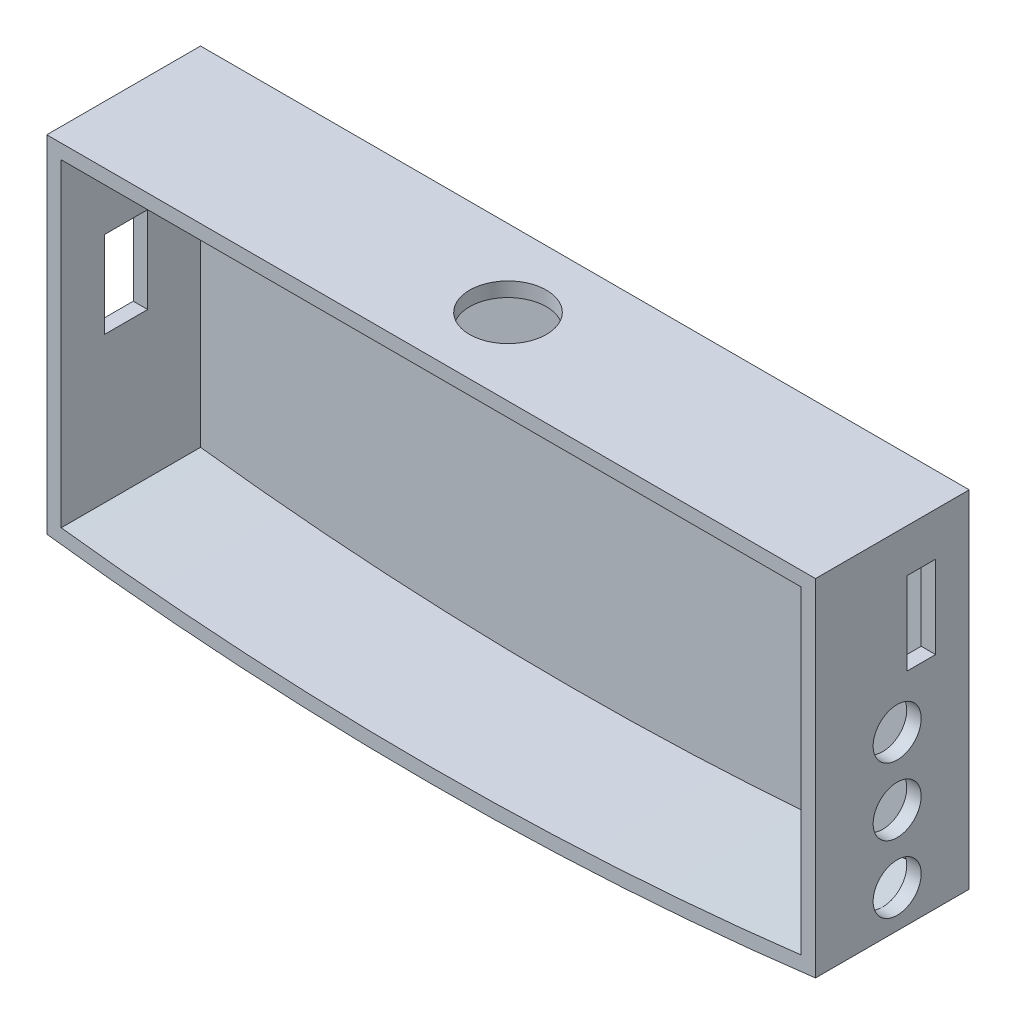
ISO-10303-21;
HEADER;
FILE_DESCRIPTION(('STEP AP214'),'2;1');
FILE_NAME('part.step','',(''),(''),'','','');
FILE_SCHEMA(('AUTOMOTIVE_DESIGN { 1 0 10303 214 1 1 1 1 }'));
ENDSEC;
DATA;
#1=APPLICATION_CONTEXT('core data for automotive mechanical design processes');
#2=APPLICATION_PROTOCOL_DEFINITION('international standard','automotive_design',2000,#1);
#3=PRODUCT_CONTEXT('',#1,'mechanical');
#4=PRODUCT('Part','Part','',(#3));
#5=PRODUCT_RELATED_PRODUCT_CATEGORY('part','',(#4));
#6=PRODUCT_DEFINITION_FORMATION('','',#4);
#7=PRODUCT_DEFINITION_CONTEXT('part definition',#1,'design');
#8=PRODUCT_DEFINITION('design','',#6,#7);
#9=PRODUCT_DEFINITION_SHAPE('','',#8);
#10=(LENGTH_UNIT() NAMED_UNIT(*) SI_UNIT(.MILLI.,.METRE.));
#11=(NAMED_UNIT(*) PLANE_ANGLE_UNIT() SI_UNIT($,.RADIAN.));
#12=(NAMED_UNIT(*) SI_UNIT($,.STERADIAN.) SOLID_ANGLE_UNIT());
#13=UNCERTAINTY_MEASURE_WITH_UNIT(LENGTH_MEASURE(1.E-05),#10,'distance_accuracy_value','');
#14=(GEOMETRIC_REPRESENTATION_CONTEXT(3) GLOBAL_UNCERTAINTY_ASSIGNED_CONTEXT((#13)) GLOBAL_UNIT_ASSIGNED_CONTEXT((#10,
#11,#12)) REPRESENTATION_CONTEXT('',''));
#15=CARTESIAN_POINT('',(0.,0.,0.));
#16=DIRECTION('',(0.,0.,1.));
#17=DIRECTION('',(1.,0.,0.));
#18=AXIS2_PLACEMENT_3D('',#15,#16,#17);
#19=CARTESIAN_POINT('',(0.,0.,16.));
#20=DIRECTION('',(0.,0.,1.));
#21=DIRECTION('',(1.,0.,0.));
#22=AXIS2_PLACEMENT_3D('',#19,#20,#21);
#23=PLANE('',#22);
#24=DIRECTION('',(0.,1.,0.));
#25=VECTOR('',#24,1.);
#26=CARTESIAN_POINT('',(-90.4205664671254,0.,16.));
#27=LINE('',#26,#25);
#28=CARTESIAN_POINT('',(-90.4205664671254,-29.6673284821631,16.));
#29=VERTEX_POINT('',#28);
#30=CARTESIAN_POINT('',(-90.4205664671254,6.33267151783695,16.));
#31=VERTEX_POINT('',#30);
#32=EDGE_CURVE('E276',#29,#31,#27,.T.);
#33=ORIENTED_EDGE('',*,*,#32,.F.);
#34=CARTESIAN_POINT('',(-50.4205664671254,289.586586920608,16.));
#35=DIRECTION('',(0.,0.,1.));
#36=DIRECTION('',(1.,0.,0.));
#37=AXIS2_PLACEMENT_3D('',#34,#35,#36);
#38=CIRCLE('',#37,321.75);
#39=CARTESIAN_POINT('',(-10.4205664671254,-29.6673284821631,16.));
#40=VERTEX_POINT('',#39);
#41=EDGE_CURVE('E279',#29,#40,#38,.T.);
#42=ORIENTED_EDGE('',*,*,#41,.T.);
#43=DIRECTION('',(0.,1.,0.));
#44=VECTOR('',#43,1.);
#45=CARTESIAN_POINT('',(-10.4205664671254,0.,16.));
#46=LINE('',#45,#44);
#47=CARTESIAN_POINT('',(-10.4205664671254,6.33267151783695,16.));
#48=VERTEX_POINT('',#47);
#49=EDGE_CURVE('E282',#40,#48,#46,.T.);
#50=ORIENTED_EDGE('',*,*,#49,.T.);
#51=DIRECTION('',(-1.,0.,0.));
#52=VECTOR('',#51,1.);
#53=CARTESIAN_POINT('',(0.,6.33267151783695,16.));
#54=LINE('',#53,#52);
#55=EDGE_CURVE('E284',#48,#31,#54,.T.);
#56=ORIENTED_EDGE('',*,*,#55,.T.);
#57=EDGE_LOOP('',(#33,#42,#50,#56));
#58=FACE_BOUND('',#57,.T.);
#59=CARTESIAN_POINT('',(-50.4205664671254,289.586586920608,16.));
#60=DIRECTION('',(0.,0.,1.));
#61=DIRECTION('',(1.,0.,0.));
#62=AXIS2_PLACEMENT_3D('',#59,#60,#61);
#63=CIRCLE('',#62,320.25);
#64=CARTESIAN_POINT('',(-88.9205664671254,-28.3407829298026,16.));
#65=VERTEX_POINT('',#64);
#66=CARTESIAN_POINT('',(-11.9205664671254,-28.3407829298025,16.));
#67=VERTEX_POINT('',#66);
#68=EDGE_CURVE('E270',#65,#67,#63,.T.);
#69=ORIENTED_EDGE('',*,*,#68,.F.);
#70=DIRECTION('',(0.,1.,0.));
#71=VECTOR('',#70,1.);
#72=CARTESIAN_POINT('',(-88.9205664671254,0.,16.));
#73=LINE('',#72,#71);
#74=CARTESIAN_POINT('',(-88.9205664671254,4.83267151783695,16.));
#75=VERTEX_POINT('',#74);
#76=EDGE_CURVE('E267',#65,#75,#73,.T.);
#77=ORIENTED_EDGE('',*,*,#76,.T.);
#78=DIRECTION('',(-1.,0.,0.));
#79=VECTOR('',#78,1.);
#80=CARTESIAN_POINT('',(0.,4.83267151783695,16.));
#81=LINE('',#80,#79);
#82=CARTESIAN_POINT('',(-11.9205664671254,4.83267151783695,16.));
#83=VERTEX_POINT('',#82);
#84=EDGE_CURVE('E256',#83,#75,#81,.T.);
#85=ORIENTED_EDGE('',*,*,#84,.F.);
#86=DIRECTION('',(0.,1.,0.));
#87=VECTOR('',#86,1.);
#88=CARTESIAN_POINT('',(-11.9205664671254,0.,16.));
#89=LINE('',#88,#87);
#90=EDGE_CURVE('E272',#67,#83,#89,.T.);
#91=ORIENTED_EDGE('',*,*,#90,.F.);
#92=EDGE_LOOP('',(#69,#77,#85,#91));
#93=FACE_BOUND('',#92,.T.);
#94=ADVANCED_FACE('F43',(#58,#93),#23,.T.);
#95=CARTESIAN_POINT('',(-90.4205664671254,0.,16.));
#96=DIRECTION('',(-1.,0.,0.));
#97=DIRECTION('',(0.,0.,1.));
#98=AXIS2_PLACEMENT_3D('',#95,#96,#97);
#99=PLANE('',#98);
#100=DIRECTION('',(0.,-1.,0.));
#101=VECTOR('',#100,1.);
#102=CARTESIAN_POINT('',(-90.4205664671254,-4.16732848216305,7.));
#103=LINE('',#102,#101);
#104=CARTESIAN_POINT('',(-90.4205664671254,-4.16732848216305,7.));
#105=VERTEX_POINT('',#104);
#106=CARTESIAN_POINT('',(-90.4205664671254,-13.1673284821631,7.));
#107=VERTEX_POINT('',#106);
#108=EDGE_CURVE('E222',#105,#107,#103,.T.);
#109=ORIENTED_EDGE('',*,*,#108,.F.);
#110=DIRECTION('',(0.,0.,-1.));
#111=VECTOR('',#110,1.);
#112=CARTESIAN_POINT('',(-90.4205664671254,-4.16732848216305,7.));
#113=LINE('',#112,#111);
#114=CARTESIAN_POINT('',(-90.4205664671254,-4.16732848216305,11.5));
#115=VERTEX_POINT('',#114);
#116=EDGE_CURVE('E230',#115,#105,#113,.T.);
#117=ORIENTED_EDGE('',*,*,#116,.F.);
#118=DIRECTION('',(0.,1.,0.));
#119=VECTOR('',#118,1.);
#120=CARTESIAN_POINT('',(-90.4205664671254,-4.16732848216305,11.5));
#121=LINE('',#120,#119);
#122=CARTESIAN_POINT('',(-90.4205664671254,-13.1673284821631,11.5));
#123=VERTEX_POINT('',#122);
#124=EDGE_CURVE('E227',#123,#115,#121,.T.);
#125=ORIENTED_EDGE('',*,*,#124,.F.);
#126=DIRECTION('',(0.,0.,1.));
#127=VECTOR('',#126,1.);
#128=CARTESIAN_POINT('',(-90.4205664671254,-13.1673284821631,7.));
#129=LINE('',#128,#127);
#130=EDGE_CURVE('E224',#107,#123,#129,.T.);
#131=ORIENTED_EDGE('',*,*,#130,.F.);
#132=EDGE_LOOP('',(#109,#117,#125,#131));
#133=FACE_BOUND('',#132,.T.);
#134=DIRECTION('',(0.,1.,0.));
#135=VECTOR('',#134,1.);
#136=CARTESIAN_POINT('',(-90.4205664671254,0.,0.));
#137=LINE('',#136,#135);
#138=CARTESIAN_POINT('',(-90.4205664671254,-29.6673284821631,0.));
#139=VERTEX_POINT('',#138);
#140=CARTESIAN_POINT('',(-90.4205664671254,6.33267151783695,0.));
#141=VERTEX_POINT('',#140);
#142=EDGE_CURVE('E251',#139,#141,#137,.T.);
#143=ORIENTED_EDGE('',*,*,#142,.F.);
#144=DIRECTION('',(0.,0.,-1.));
#145=VECTOR('',#144,1.);
#146=CARTESIAN_POINT('',(-90.4205664671254,-29.6673284821631,16.));
#147=LINE('',#146,#145);
#148=EDGE_CURVE('E11',#29,#139,#147,.T.);
#149=ORIENTED_EDGE('',*,*,#148,.F.);
#150=ORIENTED_EDGE('',*,*,#32,.T.);
#151=DIRECTION('',(0.,0.,-1.));
#152=VECTOR('',#151,1.);
#153=CARTESIAN_POINT('',(-90.4205664671254,6.33267151783695,16.));
#154=LINE('',#153,#152);
#155=EDGE_CURVE('E286',#31,#141,#154,.T.);
#156=ORIENTED_EDGE('',*,*,#155,.T.);
#157=EDGE_LOOP('',(#143,#149,#150,#156));
#158=FACE_BOUND('',#157,.T.);
#159=ADVANCED_FACE('F45',(#133,#158),#99,.T.);
#160=CARTESIAN_POINT('',(-50.4205664671254,289.586586920608,16.));
#161=DIRECTION('',(0.,0.,-1.));
#162=DIRECTION('',(-1.,0.,0.));
#163=AXIS2_PLACEMENT_3D('',#160,#161,#162);
#164=CYLINDRICAL_SURFACE('',#163,321.75);
#165=CARTESIAN_POINT('',(-50.4205664671254,289.586586920608,0.));
#166=DIRECTION('',(0.,0.,1.));
#167=DIRECTION('',(1.,0.,0.));
#168=AXIS2_PLACEMENT_3D('',#165,#166,#167);
#169=CIRCLE('',#168,321.75);
#170=CARTESIAN_POINT('',(-10.4205664671254,-29.6673284821631,0.));
#171=VERTEX_POINT('',#170);
#172=EDGE_CURVE('E289',#139,#171,#169,.T.);
#173=ORIENTED_EDGE('',*,*,#172,.T.);
#174=DIRECTION('',(0.,0.,-1.));
#175=VECTOR('',#174,1.);
#176=CARTESIAN_POINT('',(-10.4205664671254,-29.6673284821631,16.));
#177=LINE('',#176,#175);
#178=EDGE_CURVE('E52',#40,#171,#177,.T.);
#179=ORIENTED_EDGE('',*,*,#178,.F.);
#180=ORIENTED_EDGE('',*,*,#41,.F.);
#181=ORIENTED_EDGE('',*,*,#148,.T.);
#182=EDGE_LOOP('',(#173,#179,#180,#181));
#183=FACE_BOUND('',#182,.T.);
#184=ADVANCED_FACE('F320',(#183),#164,.T.);
#185=CARTESIAN_POINT('',(-10.4205664671254,0.,16.));
#186=DIRECTION('',(-1.,0.,0.));
#187=DIRECTION('',(0.,0.,1.));
#188=AXIS2_PLACEMENT_3D('',#185,#186,#187);
#189=PLANE('',#188);
#190=DIRECTION('',(0.,1.,0.));
#191=VECTOR('',#190,1.);
#192=CARTESIAN_POINT('',(-10.4205664671254,1.83267151783695,3.5));
#193=LINE('',#192,#191);
#194=CARTESIAN_POINT('',(-10.4205664671254,-6.76732848216305,3.5));
#195=VERTEX_POINT('',#194);
#196=CARTESIAN_POINT('',(-10.4205664671254,1.83267151783695,3.5));
#197=VERTEX_POINT('',#196);
#198=EDGE_CURVE('E180',#195,#197,#193,.T.);
#199=ORIENTED_EDGE('',*,*,#198,.F.);
#200=DIRECTION('',(0.,0.,-1.));
#201=VECTOR('',#200,1.);
#202=CARTESIAN_POINT('',(-10.4205664671254,-6.76732848216305,6.5));
#203=LINE('',#202,#201);
#204=CARTESIAN_POINT('',(-10.4205664671254,-6.76732848216305,6.5));
#205=VERTEX_POINT('',#204);
#206=EDGE_CURVE('E173',#205,#195,#203,.T.);
#207=ORIENTED_EDGE('',*,*,#206,.F.);
#208=DIRECTION('',(0.,-1.,0.));
#209=VECTOR('',#208,1.);
#210=CARTESIAN_POINT('',(-10.4205664671254,1.83267151783695,6.5));
#211=LINE('',#210,#209);
#212=CARTESIAN_POINT('',(-10.4205664671254,1.83267151783695,6.5));
#213=VERTEX_POINT('',#212);
#214=EDGE_CURVE('E187',#213,#205,#211,.T.);
#215=ORIENTED_EDGE('',*,*,#214,.F.);
#216=DIRECTION('',(0.,0.,1.));
#217=VECTOR('',#216,1.);
#218=CARTESIAN_POINT('',(-10.4205664671254,1.83267151783695,6.5));
#219=LINE('',#218,#217);
#220=EDGE_CURVE('E59',#197,#213,#219,.T.);
#221=ORIENTED_EDGE('',*,*,#220,.F.);
#222=EDGE_LOOP('',(#199,#207,#215,#221));
#223=FACE_BOUND('',#222,.T.);
#224=CARTESIAN_POINT('',(-10.4205664671254,-11.7673284821631,7.5));
#225=DIRECTION('',(1.,0.,0.));
#226=DIRECTION('',(0.,0.,-1.));
#227=AXIS2_PLACEMENT_3D('',#224,#225,#226);
#228=CIRCLE('',#227,2.5);
#229=CARTESIAN_POINT('',(-10.4205664671254,-11.7673284821631,5.));
#230=VERTEX_POINT('',#229);
#231=EDGE_CURVE('E198',#230,#230,#228,.T.);
#232=ORIENTED_EDGE('',*,*,#231,.F.);
#233=EDGE_LOOP('',(#232));
#234=FACE_BOUND('',#233,.T.);
#235=CARTESIAN_POINT('',(-10.4205664671254,-18.7673284821631,7.5));
#236=DIRECTION('',(1.,0.,0.));
#237=DIRECTION('',(0.,0.,-1.));
#238=AXIS2_PLACEMENT_3D('',#235,#236,#237);
#239=CIRCLE('',#238,2.5);
#240=CARTESIAN_POINT('',(-10.4205664671254,-18.7673284821631,5.));
#241=VERTEX_POINT('',#240);
#242=EDGE_CURVE('E201',#241,#241,#239,.T.);
#243=ORIENTED_EDGE('',*,*,#242,.F.);
#244=EDGE_LOOP('',(#243));
#245=FACE_BOUND('',#244,.T.);
#246=CARTESIAN_POINT('',(-10.4205664671254,-25.7673284821631,7.5));
#247=DIRECTION('',(1.,0.,0.));
#248=DIRECTION('',(0.,0.,-1.));
#249=AXIS2_PLACEMENT_3D('',#246,#247,#248);
#250=CIRCLE('',#249,2.5);
#251=CARTESIAN_POINT('',(-10.4205664671254,-25.7673284821631,5.));
#252=VERTEX_POINT('',#251);
#253=EDGE_CURVE('E209',#252,#252,#250,.T.);
#254=ORIENTED_EDGE('',*,*,#253,.F.);
#255=EDGE_LOOP('',(#254));
#256=FACE_BOUND('',#255,.T.);
#257=DIRECTION('',(0.,1.,0.));
#258=VECTOR('',#257,1.);
#259=CARTESIAN_POINT('',(-10.4205664671254,0.,0.));
#260=LINE('',#259,#258);
#261=CARTESIAN_POINT('',(-10.4205664671254,6.33267151783695,0.));
#262=VERTEX_POINT('',#261);
#263=EDGE_CURVE('E291',#171,#262,#260,.T.);
#264=ORIENTED_EDGE('',*,*,#263,.T.);
#265=DIRECTION('',(0.,0.,-1.));
#266=VECTOR('',#265,1.);
#267=CARTESIAN_POINT('',(-10.4205664671254,6.33267151783695,16.));
#268=LINE('',#267,#266);
#269=EDGE_CURVE('E296',#48,#262,#268,.T.);
#270=ORIENTED_EDGE('',*,*,#269,.F.);
#271=ORIENTED_EDGE('',*,*,#49,.F.);
#272=ORIENTED_EDGE('',*,*,#178,.T.);
#273=EDGE_LOOP('',(#264,#270,#271,#272));
#274=FACE_BOUND('',#273,.T.);
#275=ADVANCED_FACE('F304',(#223,#234,#245,#256,#274),#189,.F.);
#276=CARTESIAN_POINT('',(0.,6.33267151783695,16.));
#277=DIRECTION('',(0.,-1.,0.));
#278=DIRECTION('',(0.,0.,-1.));
#279=AXIS2_PLACEMENT_3D('',#276,#277,#278);
#280=PLANE('',#279);
#281=CARTESIAN_POINT('',(-50.4205664671254,6.33267151783695,8.));
#282=DIRECTION('',(0.,1.,0.));
#283=DIRECTION('',(0.,0.,1.));
#284=AXIS2_PLACEMENT_3D('',#281,#282,#283);
#285=CIRCLE('',#284,4.);
#286=CARTESIAN_POINT('',(-50.4205664671254,6.33267151783695,12.));
#287=VERTEX_POINT('',#286);
#288=EDGE_CURVE('E183',#287,#287,#285,.T.);
#289=ORIENTED_EDGE('',*,*,#288,.F.);
#290=EDGE_LOOP('',(#289));
#291=FACE_BOUND('',#290,.T.);
#292=DIRECTION('',(-1.,0.,0.));
#293=VECTOR('',#292,1.);
#294=CARTESIAN_POINT('',(0.,6.33267151783695,0.));
#295=LINE('',#294,#293);
#296=EDGE_CURVE('E280',#262,#141,#295,.T.);
#297=ORIENTED_EDGE('',*,*,#296,.T.);
#298=ORIENTED_EDGE('',*,*,#155,.F.);
#299=ORIENTED_EDGE('',*,*,#55,.F.);
#300=ORIENTED_EDGE('',*,*,#269,.T.);
#301=EDGE_LOOP('',(#297,#298,#299,#300));
#302=FACE_BOUND('',#301,.T.);
#303=ADVANCED_FACE('F315',(#291,#302),#280,.F.);
#304=CARTESIAN_POINT('',(0.,0.,0.));
#305=DIRECTION('',(0.,0.,1.));
#306=DIRECTION('',(1.,0.,0.));
#307=AXIS2_PLACEMENT_3D('',#304,#305,#306);
#308=PLANE('',#307);
#309=ORIENTED_EDGE('',*,*,#142,.T.);
#310=ORIENTED_EDGE('',*,*,#296,.F.);
#311=ORIENTED_EDGE('',*,*,#263,.F.);
#312=ORIENTED_EDGE('',*,*,#172,.F.);
#313=EDGE_LOOP('',(#309,#310,#311,#312));
#314=FACE_BOUND('',#313,.T.);
#315=ADVANCED_FACE('F311',(#314),#308,.F.);
#316=CARTESIAN_POINT('',(-88.9205664671254,0.,16.));
#317=DIRECTION('',(-1.,0.,0.));
#318=DIRECTION('',(0.,0.,1.));
#319=AXIS2_PLACEMENT_3D('',#316,#317,#318);
#320=PLANE('',#319);
#321=DIRECTION('',(0.,0.,1.));
#322=VECTOR('',#321,1.);
#323=CARTESIAN_POINT('',(-88.9205664671254,-4.16732848216305,7.));
#324=LINE('',#323,#322);
#325=CARTESIAN_POINT('',(-88.9205664671254,-4.16732848216305,7.));
#326=VERTEX_POINT('',#325);
#327=CARTESIAN_POINT('',(-88.9205664671254,-4.16732848216305,11.5));
#328=VERTEX_POINT('',#327);
#329=EDGE_CURVE('E216',#326,#328,#324,.T.);
#330=ORIENTED_EDGE('',*,*,#329,.F.);
#331=DIRECTION('',(0.,1.,0.));
#332=VECTOR('',#331,1.);
#333=CARTESIAN_POINT('',(-88.9205664671254,-4.16732848216305,7.));
#334=LINE('',#333,#332);
#335=CARTESIAN_POINT('',(-88.9205664671254,-13.1673284821631,7.));
#336=VERTEX_POINT('',#335);
#337=EDGE_CURVE('E219',#336,#326,#334,.T.);
#338=ORIENTED_EDGE('',*,*,#337,.F.);
#339=DIRECTION('',(0.,0.,-1.));
#340=VECTOR('',#339,1.);
#341=CARTESIAN_POINT('',(-88.9205664671254,-13.1673284821631,7.));
#342=LINE('',#341,#340);
#343=CARTESIAN_POINT('',(-88.9205664671254,-13.1673284821631,11.5));
#344=VERTEX_POINT('',#343);
#345=EDGE_CURVE('E236',#344,#336,#342,.T.);
#346=ORIENTED_EDGE('',*,*,#345,.F.);
#347=DIRECTION('',(0.,-1.,0.));
#348=VECTOR('',#347,1.);
#349=CARTESIAN_POINT('',(-88.9205664671254,-4.16732848216305,11.5));
#350=LINE('',#349,#348);
#351=EDGE_CURVE('E197',#328,#344,#350,.T.);
#352=ORIENTED_EDGE('',*,*,#351,.F.);
#353=EDGE_LOOP('',(#330,#338,#346,#352));
#354=FACE_BOUND('',#353,.T.);
#355=DIRECTION('',(0.,1.,0.));
#356=VECTOR('',#355,1.);
#357=CARTESIAN_POINT('',(-88.9205664671254,0.,1.5));
#358=LINE('',#357,#356);
#359=CARTESIAN_POINT('',(-88.9205664671254,-28.3407829298026,1.5));
#360=VERTEX_POINT('',#359);
#361=CARTESIAN_POINT('',(-88.9205664671254,4.83267151783695,1.5));
#362=VERTEX_POINT('',#361);
#363=EDGE_CURVE('E245',#360,#362,#358,.T.);
#364=ORIENTED_EDGE('',*,*,#363,.T.);
#365=DIRECTION('',(0.,0.,-1.));
#366=VECTOR('',#365,1.);
#367=CARTESIAN_POINT('',(-88.9205664671254,4.83267151783695,16.));
#368=LINE('',#367,#366);
#369=EDGE_CURVE('E253',#75,#362,#368,.T.);
#370=ORIENTED_EDGE('',*,*,#369,.F.);
#371=ORIENTED_EDGE('',*,*,#76,.F.);
#372=DIRECTION('',(0.,0.,-1.));
#373=VECTOR('',#372,1.);
#374=CARTESIAN_POINT('',(-88.9205664671254,-28.3407829298026,16.));
#375=LINE('',#374,#373);
#376=EDGE_CURVE('E249',#65,#360,#375,.T.);
#377=ORIENTED_EDGE('',*,*,#376,.T.);
#378=EDGE_LOOP('',(#364,#370,#371,#377));
#379=FACE_BOUND('',#378,.T.);
#380=ADVANCED_FACE('F343',(#354,#379),#320,.F.);
#381=CARTESIAN_POINT('',(-50.4205664671254,289.586586920608,16.));
#382=DIRECTION('',(0.,0.,-1.));
#383=DIRECTION('',(-1.,0.,0.));
#384=AXIS2_PLACEMENT_3D('',#381,#382,#383);
#385=CYLINDRICAL_SURFACE('',#384,320.25);
#386=CARTESIAN_POINT('',(-50.4205664671254,289.586586920608,1.5));
#387=DIRECTION('',(0.,0.,1.));
#388=DIRECTION('',(1.,0.,0.));
#389=AXIS2_PLACEMENT_3D('',#386,#387,#388);
#390=CIRCLE('',#389,320.25);
#391=CARTESIAN_POINT('',(-11.9205664671254,-28.3407829298025,1.5));
#392=VERTEX_POINT('',#391);
#393=EDGE_CURVE('E248',#360,#392,#390,.T.);
#394=ORIENTED_EDGE('',*,*,#393,.F.);
#395=ORIENTED_EDGE('',*,*,#376,.F.);
#396=ORIENTED_EDGE('',*,*,#68,.T.);
#397=DIRECTION('',(0.,0.,-1.));
#398=VECTOR('',#397,1.);
#399=CARTESIAN_POINT('',(-11.9205664671254,-28.3407829298025,16.));
#400=LINE('',#399,#398);
#401=EDGE_CURVE('E252',#67,#392,#400,.T.);
#402=ORIENTED_EDGE('',*,*,#401,.T.);
#403=EDGE_LOOP('',(#394,#395,#396,#402));
#404=FACE_BOUND('',#403,.T.);
#405=ADVANCED_FACE('F365',(#404),#385,.F.);
#406=CARTESIAN_POINT('',(-11.9205664671254,0.,16.));
#407=DIRECTION('',(-1.,0.,0.));
#408=DIRECTION('',(0.,0.,1.));
#409=AXIS2_PLACEMENT_3D('',#406,#407,#408);
#410=PLANE('',#409);
#411=DIRECTION('',(0.,0.,-1.));
#412=VECTOR('',#411,1.);
#413=CARTESIAN_POINT('',(-11.9205664671254,-6.76732848216305,6.5));
#414=LINE('',#413,#412);
#415=CARTESIAN_POINT('',(-11.9205664671254,-6.76732848216305,6.5));
#416=VERTEX_POINT('',#415);
#417=CARTESIAN_POINT('',(-11.9205664671254,-6.76732848216305,3.5));
#418=VERTEX_POINT('',#417);
#419=EDGE_CURVE('E170',#416,#418,#414,.T.);
#420=ORIENTED_EDGE('',*,*,#419,.T.);
#421=DIRECTION('',(0.,1.,0.));
#422=VECTOR('',#421,1.);
#423=CARTESIAN_POINT('',(-11.9205664671254,1.83267151783695,3.5));
#424=LINE('',#423,#422);
#425=CARTESIAN_POINT('',(-11.9205664671254,1.83267151783695,3.5));
#426=VERTEX_POINT('',#425);
#427=EDGE_CURVE('E157',#418,#426,#424,.T.);
#428=ORIENTED_EDGE('',*,*,#427,.T.);
#429=DIRECTION('',(0.,0.,1.));
#430=VECTOR('',#429,1.);
#431=CARTESIAN_POINT('',(-11.9205664671254,1.83267151783695,6.5));
#432=LINE('',#431,#430);
#433=CARTESIAN_POINT('',(-11.9205664671254,1.83267151783695,6.5));
#434=VERTEX_POINT('',#433);
#435=EDGE_CURVE('E192',#426,#434,#432,.T.);
#436=ORIENTED_EDGE('',*,*,#435,.T.);
#437=DIRECTION('',(0.,-1.,0.));
#438=VECTOR('',#437,1.);
#439=CARTESIAN_POINT('',(-11.9205664671254,1.83267151783695,6.5));
#440=LINE('',#439,#438);
#441=EDGE_CURVE('E178',#434,#416,#440,.T.);
#442=ORIENTED_EDGE('',*,*,#441,.T.);
#443=EDGE_LOOP('',(#420,#428,#436,#442));
#444=FACE_BOUND('',#443,.T.);
#445=CARTESIAN_POINT('',(-11.9205664671254,-11.7673284821631,7.5));
#446=DIRECTION('',(-1.,0.,0.));
#447=DIRECTION('',(0.,0.,1.));
#448=AXIS2_PLACEMENT_3D('',#445,#446,#447);
#449=CIRCLE('',#448,2.5);
#450=CARTESIAN_POINT('',(-11.9205664671254,-11.7673284821631,10.));
#451=VERTEX_POINT('',#450);
#452=EDGE_CURVE('E189',#451,#451,#449,.F.);
#453=ORIENTED_EDGE('',*,*,#452,.T.);
#454=EDGE_LOOP('',(#453));
#455=FACE_BOUND('',#454,.T.);
#456=CARTESIAN_POINT('',(-11.9205664671254,-18.7673284821631,7.5));
#457=DIRECTION('',(-1.,0.,0.));
#458=DIRECTION('',(0.,0.,1.));
#459=AXIS2_PLACEMENT_3D('',#456,#457,#458);
#460=CIRCLE('',#459,2.5);
#461=CARTESIAN_POINT('',(-11.9205664671254,-18.7673284821631,10.));
#462=VERTEX_POINT('',#461);
#463=EDGE_CURVE('E206',#462,#462,#460,.F.);
#464=ORIENTED_EDGE('',*,*,#463,.T.);
#465=EDGE_LOOP('',(#464));
#466=FACE_BOUND('',#465,.T.);
#467=CARTESIAN_POINT('',(-11.9205664671254,-25.7673284821631,7.5));
#468=DIRECTION('',(-1.,0.,0.));
#469=DIRECTION('',(0.,0.,1.));
#470=AXIS2_PLACEMENT_3D('',#467,#468,#469);
#471=CIRCLE('',#470,2.5);
#472=CARTESIAN_POINT('',(-11.9205664671254,-25.7673284821631,10.));
#473=VERTEX_POINT('',#472);
#474=EDGE_CURVE('E212',#473,#473,#471,.F.);
#475=ORIENTED_EDGE('',*,*,#474,.T.);
#476=EDGE_LOOP('',(#475));
#477=FACE_BOUND('',#476,.T.);
#478=DIRECTION('',(0.,1.,0.));
#479=VECTOR('',#478,1.);
#480=CARTESIAN_POINT('',(-11.9205664671254,0.,1.5));
#481=LINE('',#480,#479);
#482=CARTESIAN_POINT('',(-11.9205664671254,4.83267151783695,1.5));
#483=VERTEX_POINT('',#482);
#484=EDGE_CURVE('E258',#392,#483,#481,.T.);
#485=ORIENTED_EDGE('',*,*,#484,.F.);
#486=ORIENTED_EDGE('',*,*,#401,.F.);
#487=ORIENTED_EDGE('',*,*,#90,.T.);
#488=DIRECTION('',(0.,0.,-1.));
#489=VECTOR('',#488,1.);
#490=CARTESIAN_POINT('',(-11.9205664671254,4.83267151783695,16.));
#491=LINE('',#490,#489);
#492=EDGE_CURVE('E255',#83,#483,#491,.T.);
#493=ORIENTED_EDGE('',*,*,#492,.T.);
#494=EDGE_LOOP('',(#485,#486,#487,#493));
#495=FACE_BOUND('',#494,.T.);
#496=ADVANCED_FACE('F176',(#444,#455,#466,#477,#495),#410,.T.);
#497=CARTESIAN_POINT('',(0.,4.83267151783695,16.));
#498=DIRECTION('',(0.,-1.,0.));
#499=DIRECTION('',(0.,0.,-1.));
#500=AXIS2_PLACEMENT_3D('',#497,#498,#499);
#501=PLANE('',#500);
#502=CARTESIAN_POINT('',(-50.4205664671254,4.83267151783695,8.));
#503=DIRECTION('',(0.,-1.,0.));
#504=DIRECTION('',(0.,0.,-1.));
#505=AXIS2_PLACEMENT_3D('',#502,#503,#504);
#506=CIRCLE('',#505,4.);
#507=CARTESIAN_POINT('',(-50.4205664671254,4.83267151783695,4.));
#508=VERTEX_POINT('',#507);
#509=EDGE_CURVE('E47',#508,#508,#506,.T.);
#510=ORIENTED_EDGE('',*,*,#509,.F.);
#511=EDGE_LOOP('',(#510));
#512=FACE_BOUND('',#511,.T.);
#513=DIRECTION('',(-1.,0.,0.));
#514=VECTOR('',#513,1.);
#515=CARTESIAN_POINT('',(0.,4.83267151783695,1.5));
#516=LINE('',#515,#514);
#517=EDGE_CURVE('E262',#483,#362,#516,.T.);
#518=ORIENTED_EDGE('',*,*,#517,.F.);
#519=ORIENTED_EDGE('',*,*,#492,.F.);
#520=ORIENTED_EDGE('',*,*,#84,.T.);
#521=ORIENTED_EDGE('',*,*,#369,.T.);
#522=EDGE_LOOP('',(#518,#519,#520,#521));
#523=FACE_BOUND('',#522,.T.);
#524=ADVANCED_FACE('F371',(#512,#523),#501,.T.);
#525=CARTESIAN_POINT('',(0.,0.,1.5));
#526=DIRECTION('',(0.,0.,1.));
#527=DIRECTION('',(1.,0.,0.));
#528=AXIS2_PLACEMENT_3D('',#525,#526,#527);
#529=PLANE('',#528);
#530=ORIENTED_EDGE('',*,*,#363,.F.);
#531=ORIENTED_EDGE('',*,*,#393,.T.);
#532=ORIENTED_EDGE('',*,*,#484,.T.);
#533=ORIENTED_EDGE('',*,*,#517,.T.);
#534=EDGE_LOOP('',(#530,#531,#532,#533));
#535=FACE_BOUND('',#534,.T.);
#536=ADVANCED_FACE('F362',(#535),#529,.T.);
#537=CARTESIAN_POINT('',(-10.4195664671254,-4.16732848216305,7.));
#538=DIRECTION('',(0.,0.,-1.));
#539=DIRECTION('',(0.,1.,0.));
#540=AXIS2_PLACEMENT_3D('',#537,#538,#539);
#541=PLANE('',#540);
#542=ORIENTED_EDGE('',*,*,#337,.T.);
#543=DIRECTION('',(-1.,0.,0.));
#544=VECTOR('',#543,1.);
#545=CARTESIAN_POINT('',(-10.4195664671254,-4.16732848216305,7.));
#546=LINE('',#545,#544);
#547=EDGE_CURVE('E234',#326,#105,#546,.T.);
#548=ORIENTED_EDGE('',*,*,#547,.T.);
#549=ORIENTED_EDGE('',*,*,#108,.T.);
#550=DIRECTION('',(-1.,0.,0.));
#551=VECTOR('',#550,1.);
#552=CARTESIAN_POINT('',(-10.4195664671254,-13.1673284821631,7.));
#553=LINE('',#552,#551);
#554=EDGE_CURVE('E233',#336,#107,#553,.T.);
#555=ORIENTED_EDGE('',*,*,#554,.F.);
#556=EDGE_LOOP('',(#542,#548,#549,#555));
#557=FACE_BOUND('',#556,.T.);
#558=ADVANCED_FACE('F334',(#557),#541,.F.);
#559=CARTESIAN_POINT('',(-10.4195664671254,-4.16732848216305,7.));
#560=DIRECTION('',(0.,1.,0.));
#561=DIRECTION('',(0.,0.,1.));
#562=AXIS2_PLACEMENT_3D('',#559,#560,#561);
#563=PLANE('',#562);
#564=ORIENTED_EDGE('',*,*,#329,.T.);
#565=DIRECTION('',(-1.,0.,0.));
#566=VECTOR('',#565,1.);
#567=CARTESIAN_POINT('',(-10.4195664671254,-4.16732848216305,11.5));
#568=LINE('',#567,#566);
#569=EDGE_CURVE('E237',#328,#115,#568,.T.);
#570=ORIENTED_EDGE('',*,*,#569,.T.);
#571=ORIENTED_EDGE('',*,*,#116,.T.);
#572=ORIENTED_EDGE('',*,*,#547,.F.);
#573=EDGE_LOOP('',(#564,#570,#571,#572));
#574=FACE_BOUND('',#573,.T.);
#575=ADVANCED_FACE('F346',(#574),#563,.F.);
#576=CARTESIAN_POINT('',(-10.4195664671254,-4.16732848216305,11.5));
#577=DIRECTION('',(0.,0.,1.));
#578=DIRECTION('',(0.,-1.,0.));
#579=AXIS2_PLACEMENT_3D('',#576,#577,#578);
#580=PLANE('',#579);
#581=ORIENTED_EDGE('',*,*,#351,.T.);
#582=DIRECTION('',(-1.,0.,0.));
#583=VECTOR('',#582,1.);
#584=CARTESIAN_POINT('',(-10.4195664671254,-13.1673284821631,11.5));
#585=LINE('',#584,#583);
#586=EDGE_CURVE('E239',#344,#123,#585,.T.);
#587=ORIENTED_EDGE('',*,*,#586,.T.);
#588=ORIENTED_EDGE('',*,*,#124,.T.);
#589=ORIENTED_EDGE('',*,*,#569,.F.);
#590=EDGE_LOOP('',(#581,#587,#588,#589));
#591=FACE_BOUND('',#590,.T.);
#592=ADVANCED_FACE('F348',(#591),#580,.F.);
#593=CARTESIAN_POINT('',(-10.4195664671254,-13.1673284821631,7.));
#594=DIRECTION('',(0.,-1.,0.));
#595=DIRECTION('',(0.,0.,-1.));
#596=AXIS2_PLACEMENT_3D('',#593,#594,#595);
#597=PLANE('',#596);
#598=ORIENTED_EDGE('',*,*,#345,.T.);
#599=ORIENTED_EDGE('',*,*,#554,.T.);
#600=ORIENTED_EDGE('',*,*,#130,.T.);
#601=ORIENTED_EDGE('',*,*,#586,.F.);
#602=EDGE_LOOP('',(#598,#599,#600,#601));
#603=FACE_BOUND('',#602,.T.);
#604=ADVANCED_FACE('F336',(#603),#597,.F.);
#605=CARTESIAN_POINT('',(-90.4215664671254,-25.7673284821631,7.5));
#606=DIRECTION('',(1.,0.,0.));
#607=DIRECTION('',(0.,0.,-1.));
#608=AXIS2_PLACEMENT_3D('',#605,#606,#607);
#609=CYLINDRICAL_SURFACE('',#608,2.5);
#610=ORIENTED_EDGE('',*,*,#474,.F.);
#611=EDGE_LOOP('',(#610));
#612=FACE_BOUND('',#611,.T.);
#613=ORIENTED_EDGE('',*,*,#253,.T.);
#614=EDGE_LOOP('',(#613));
#615=FACE_BOUND('',#614,.T.);
#616=ADVANCED_FACE('F355',(#612,#615),#609,.F.);
#617=CARTESIAN_POINT('',(-90.4215664671254,-18.7673284821631,7.5));
#618=DIRECTION('',(1.,0.,0.));
#619=DIRECTION('',(0.,0.,-1.));
#620=AXIS2_PLACEMENT_3D('',#617,#618,#619);
#621=CYLINDRICAL_SURFACE('',#620,2.5);
#622=ORIENTED_EDGE('',*,*,#463,.F.);
#623=EDGE_LOOP('',(#622));
#624=FACE_BOUND('',#623,.T.);
#625=ORIENTED_EDGE('',*,*,#242,.T.);
#626=EDGE_LOOP('',(#625));
#627=FACE_BOUND('',#626,.T.);
#628=ADVANCED_FACE('F395',(#624,#627),#621,.F.);
#629=CARTESIAN_POINT('',(-90.4215664671254,-11.7673284821631,7.5));
#630=DIRECTION('',(1.,0.,0.));
#631=DIRECTION('',(0.,0.,-1.));
#632=AXIS2_PLACEMENT_3D('',#629,#630,#631);
#633=CYLINDRICAL_SURFACE('',#632,2.5);
#634=ORIENTED_EDGE('',*,*,#452,.F.);
#635=EDGE_LOOP('',(#634));
#636=FACE_BOUND('',#635,.T.);
#637=ORIENTED_EDGE('',*,*,#231,.T.);
#638=EDGE_LOOP('',(#637));
#639=FACE_BOUND('',#638,.T.);
#640=ADVANCED_FACE('F400',(#636,#639),#633,.F.);
#641=CARTESIAN_POINT('',(-90.4215664671254,-6.76732848216305,6.5));
#642=DIRECTION('',(0.,-1.,0.));
#643=DIRECTION('',(0.,0.,-1.));
#644=AXIS2_PLACEMENT_3D('',#641,#642,#643);
#645=PLANE('',#644);
#646=DIRECTION('',(1.,0.,0.));
#647=VECTOR('',#646,1.);
#648=CARTESIAN_POINT('',(-90.4215664671254,-6.76732848216305,6.5));
#649=LINE('',#648,#647);
#650=EDGE_CURVE('E67',#416,#205,#649,.T.);
#651=ORIENTED_EDGE('',*,*,#650,.T.);
#652=ORIENTED_EDGE('',*,*,#206,.T.);
#653=DIRECTION('',(1.,0.,0.));
#654=VECTOR('',#653,1.);
#655=CARTESIAN_POINT('',(-90.4215664671254,-6.76732848216305,3.5));
#656=LINE('',#655,#654);
#657=EDGE_CURVE('E161',#418,#195,#656,.T.);
#658=ORIENTED_EDGE('',*,*,#657,.F.);
#659=ORIENTED_EDGE('',*,*,#419,.F.);
#660=EDGE_LOOP('',(#651,#652,#658,#659));
#661=FACE_BOUND('',#660,.T.);
#662=ADVANCED_FACE('F169',(#661),#645,.F.);
#663=CARTESIAN_POINT('',(-90.4215664671254,1.83267151783695,3.5));
#664=DIRECTION('',(0.,0.,-1.));
#665=DIRECTION('',(0.,1.,0.));
#666=AXIS2_PLACEMENT_3D('',#663,#664,#665);
#667=PLANE('',#666);
#668=ORIENTED_EDGE('',*,*,#657,.T.);
#669=ORIENTED_EDGE('',*,*,#198,.T.);
#670=DIRECTION('',(1.,0.,0.));
#671=VECTOR('',#670,1.);
#672=CARTESIAN_POINT('',(-90.4215664671254,1.83267151783695,3.5));
#673=LINE('',#672,#671);
#674=EDGE_CURVE('E163',#426,#197,#673,.T.);
#675=ORIENTED_EDGE('',*,*,#674,.F.);
#676=ORIENTED_EDGE('',*,*,#427,.F.);
#677=EDGE_LOOP('',(#668,#669,#675,#676));
#678=FACE_BOUND('',#677,.T.);
#679=ADVANCED_FACE('F159',(#678),#667,.F.);
#680=CARTESIAN_POINT('',(-90.4215664671254,1.83267151783695,6.5));
#681=DIRECTION('',(0.,1.,0.));
#682=DIRECTION('',(0.,0.,1.));
#683=AXIS2_PLACEMENT_3D('',#680,#681,#682);
#684=PLANE('',#683);
#685=ORIENTED_EDGE('',*,*,#674,.T.);
#686=ORIENTED_EDGE('',*,*,#220,.T.);
#687=DIRECTION('',(1.,0.,0.));
#688=VECTOR('',#687,1.);
#689=CARTESIAN_POINT('',(-90.4215664671254,1.83267151783695,6.5));
#690=LINE('',#689,#688);
#691=EDGE_CURVE('E191',#434,#213,#690,.T.);
#692=ORIENTED_EDGE('',*,*,#691,.F.);
#693=ORIENTED_EDGE('',*,*,#435,.F.);
#694=EDGE_LOOP('',(#685,#686,#692,#693));
#695=FACE_BOUND('',#694,.T.);
#696=ADVANCED_FACE('F412',(#695),#684,.F.);
#697=CARTESIAN_POINT('',(-90.4215664671254,1.83267151783695,6.5));
#698=DIRECTION('',(0.,0.,1.));
#699=DIRECTION('',(0.,-1.,0.));
#700=AXIS2_PLACEMENT_3D('',#697,#698,#699);
#701=PLANE('',#700);
#702=ORIENTED_EDGE('',*,*,#691,.T.);
#703=ORIENTED_EDGE('',*,*,#214,.T.);
#704=ORIENTED_EDGE('',*,*,#650,.F.);
#705=ORIENTED_EDGE('',*,*,#441,.F.);
#706=EDGE_LOOP('',(#702,#703,#704,#705));
#707=FACE_BOUND('',#706,.T.);
#708=ADVANCED_FACE('F415',(#707),#701,.F.);
#709=CARTESIAN_POINT('',(-50.4205664671254,4.33267151783695,8.));
#710=DIRECTION('',(0.,1.,0.));
#711=DIRECTION('',(0.,0.,1.));
#712=AXIS2_PLACEMENT_3D('',#709,#710,#711);
#713=CYLINDRICAL_SURFACE('',#712,4.);
#714=ORIENTED_EDGE('',*,*,#509,.T.);
#715=EDGE_LOOP('',(#714));
#716=FACE_BOUND('',#715,.T.);
#717=ORIENTED_EDGE('',*,*,#288,.T.);
#718=EDGE_LOOP('',(#717));
#719=FACE_BOUND('',#718,.T.);
#720=ADVANCED_FACE('F418',(#716,#719),#713,.F.);
#721=CLOSED_SHELL('',(#94,#159,#184,#275,#303,#315,#380,#405,#496,#524,#536,#558,#575,#592,#604,
#616,#628,#640,#662,#679,#696,#708,#720));
#722=MANIFOLD_SOLID_BREP('B2',#721);
#723=ADVANCED_BREP_SHAPE_REPRESENTATION('',(#18,#722),#14);
#724=SHAPE_DEFINITION_REPRESENTATION(#9,#723);
ENDSEC;
END-ISO-10303-21;
